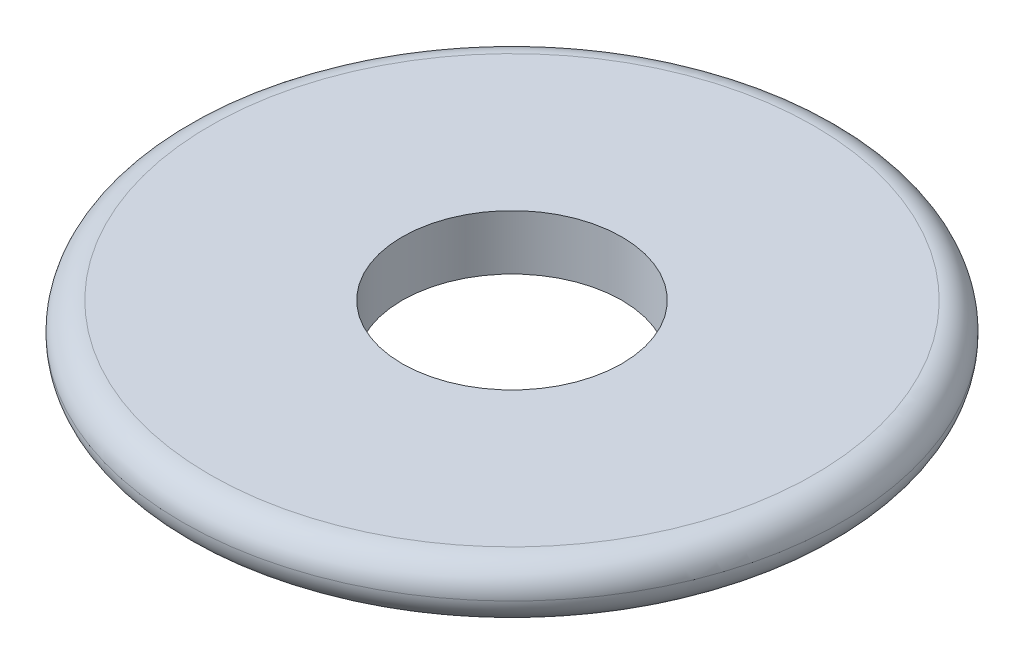
ISO-10303-21;
HEADER;
FILE_DESCRIPTION(('STEP AP214'),'2;1');
FILE_NAME('part.step','',(''),(''),'','','');
FILE_SCHEMA(('AUTOMOTIVE_DESIGN { 1 0 10303 214 1 1 1 1 }'));
ENDSEC;
DATA;
#1=APPLICATION_CONTEXT('core data for automotive mechanical design processes');
#2=APPLICATION_PROTOCOL_DEFINITION('international standard','automotive_design',2000,#1);
#3=PRODUCT_CONTEXT('',#1,'mechanical');
#4=PRODUCT('Part','Part','',(#3));
#5=PRODUCT_RELATED_PRODUCT_CATEGORY('part','',(#4));
#6=PRODUCT_DEFINITION_FORMATION('','',#4);
#7=PRODUCT_DEFINITION_CONTEXT('part definition',#1,'design');
#8=PRODUCT_DEFINITION('design','',#6,#7);
#9=PRODUCT_DEFINITION_SHAPE('','',#8);
#10=(LENGTH_UNIT() NAMED_UNIT(*) SI_UNIT(.MILLI.,.METRE.));
#11=(NAMED_UNIT(*) PLANE_ANGLE_UNIT() SI_UNIT($,.RADIAN.));
#12=(NAMED_UNIT(*) SI_UNIT($,.STERADIAN.) SOLID_ANGLE_UNIT());
#13=UNCERTAINTY_MEASURE_WITH_UNIT(LENGTH_MEASURE(1.E-05),#10,'distance_accuracy_value','');
#14=(GEOMETRIC_REPRESENTATION_CONTEXT(3) GLOBAL_UNCERTAINTY_ASSIGNED_CONTEXT((#13)) GLOBAL_UNIT_ASSIGNED_CONTEXT((#10,
#11,#12)) REPRESENTATION_CONTEXT('',''));
#15=CARTESIAN_POINT('',(0.,0.,0.));
#16=DIRECTION('',(0.,0.,1.));
#17=DIRECTION('',(1.,0.,0.));
#18=AXIS2_PLACEMENT_3D('',#15,#16,#17);
#19=CARTESIAN_POINT('',(0.,1.,0.));
#20=DIRECTION('',(0.,1.,0.));
#21=DIRECTION('',(0.,0.,1.));
#22=AXIS2_PLACEMENT_3D('',#19,#20,#21);
#23=PLANE('',#22);
#24=CARTESIAN_POINT('',(0.,1.,0.));
#25=DIRECTION('',(0.,1.,0.));
#26=DIRECTION('',(0.,0.,1.));
#27=AXIS2_PLACEMENT_3D('',#24,#25,#26);
#28=CIRCLE('',#27,11.);
#29=CARTESIAN_POINT('',(0.,1.,11.));
#30=VERTEX_POINT('',#29);
#31=EDGE_CURVE('E10',#30,#30,#28,.T.);
#32=ORIENTED_EDGE('',*,*,#31,.T.);
#33=EDGE_LOOP('',(#32));
#34=FACE_BOUND('',#33,.T.);
#35=CARTESIAN_POINT('',(0.,1.,0.));
#36=DIRECTION('',(0.,1.,0.));
#37=DIRECTION('',(0.,0.,1.));
#38=AXIS2_PLACEMENT_3D('',#35,#36,#37);
#39=CIRCLE('',#38,4.);
#40=CARTESIAN_POINT('',(0.,1.,4.));
#41=VERTEX_POINT('',#40);
#42=EDGE_CURVE('E44',#41,#41,#39,.T.);
#43=ORIENTED_EDGE('',*,*,#42,.F.);
#44=EDGE_LOOP('',(#43));
#45=FACE_BOUND('',#44,.T.);
#46=ADVANCED_FACE('F32',(#34,#45),#23,.T.);
#47=CARTESIAN_POINT('',(0.,-1.,0.));
#48=DIRECTION('',(0.,1.,0.));
#49=DIRECTION('',(0.,0.,1.));
#50=AXIS2_PLACEMENT_3D('',#47,#48,#49);
#51=PLANE('',#50);
#52=CARTESIAN_POINT('',(0.,-1.,0.));
#53=DIRECTION('',(0.,1.,0.));
#54=DIRECTION('',(0.,0.,1.));
#55=AXIS2_PLACEMENT_3D('',#52,#53,#54);
#56=CIRCLE('',#55,11.);
#57=CARTESIAN_POINT('',(0.,-1.,11.));
#58=VERTEX_POINT('',#57);
#59=EDGE_CURVE('E40',#58,#58,#56,.F.);
#60=ORIENTED_EDGE('',*,*,#59,.T.);
#61=EDGE_LOOP('',(#60));
#62=FACE_BOUND('',#61,.T.);
#63=CARTESIAN_POINT('',(0.,-1.,0.));
#64=DIRECTION('',(0.,1.,0.));
#65=DIRECTION('',(0.,0.,1.));
#66=AXIS2_PLACEMENT_3D('',#63,#64,#65);
#67=CIRCLE('',#66,4.);
#68=CARTESIAN_POINT('',(0.,-1.,4.));
#69=VERTEX_POINT('',#68);
#70=EDGE_CURVE('E47',#69,#69,#67,.T.);
#71=ORIENTED_EDGE('',*,*,#70,.T.);
#72=EDGE_LOOP('',(#71));
#73=FACE_BOUND('',#72,.T.);
#74=ADVANCED_FACE('F57',(#62,#73),#51,.F.);
#75=CARTESIAN_POINT('',(0.,1.,0.));
#76=DIRECTION('',(0.,-1.,0.));
#77=DIRECTION('',(0.,0.,-1.));
#78=AXIS2_PLACEMENT_3D('',#75,#76,#77);
#79=CYLINDRICAL_SURFACE('',#78,4.);
#80=ORIENTED_EDGE('',*,*,#42,.T.);
#81=EDGE_LOOP('',(#80));
#82=FACE_BOUND('',#81,.T.);
#83=ORIENTED_EDGE('',*,*,#70,.F.);
#84=EDGE_LOOP('',(#83));
#85=FACE_BOUND('',#84,.T.);
#86=ADVANCED_FACE('F53',(#82,#85),#79,.F.);
#87=CARTESIAN_POINT('',(0.,0.,0.));
#88=DIRECTION('',(0.,1.,0.));
#89=DIRECTION('',(0.,0.,1.));
#90=AXIS2_PLACEMENT_3D('',#87,#88,#89);
#91=TOROIDAL_SURFACE('',#90,11.,1.);
#92=ORIENTED_EDGE('',*,*,#31,.F.);
#93=EDGE_LOOP('',(#92));
#94=FACE_BOUND('',#93,.T.);
#95=CARTESIAN_POINT('',(0.,0.,0.));
#96=DIRECTION('',(0.,1.,0.));
#97=DIRECTION('',(0.,0.,1.));
#98=AXIS2_PLACEMENT_3D('',#95,#96,#97);
#99=CIRCLE('',#98,12.);
#100=CARTESIAN_POINT('',(0.,0.,12.));
#101=VERTEX_POINT('',#100);
#102=EDGE_CURVE('E36',#101,#101,#99,.F.);
#103=ORIENTED_EDGE('',*,*,#102,.F.);
#104=EDGE_LOOP('',(#103));
#105=FACE_BOUND('',#104,.T.);
#106=ADVANCED_FACE('F34',(#94,#105),#91,.T.);
#107=CARTESIAN_POINT('',(0.,0.,0.));
#108=DIRECTION('',(0.,1.,0.));
#109=DIRECTION('',(0.,0.,1.));
#110=AXIS2_PLACEMENT_3D('',#107,#108,#109);
#111=TOROIDAL_SURFACE('',#110,11.,1.);
#112=ORIENTED_EDGE('',*,*,#59,.F.);
#113=EDGE_LOOP('',(#112));
#114=FACE_BOUND('',#113,.T.);
#115=ORIENTED_EDGE('',*,*,#102,.T.);
#116=EDGE_LOOP('',(#115));
#117=FACE_BOUND('',#116,.T.);
#118=ADVANCED_FACE('F65',(#114,#117),#111,.T.);
#119=CLOSED_SHELL('',(#46,#74,#86,#106,#118));
#120=MANIFOLD_SOLID_BREP('B2',#119);
#121=ADVANCED_BREP_SHAPE_REPRESENTATION('',(#18,#120),#14);
#122=SHAPE_DEFINITION_REPRESENTATION(#9,#121);
ENDSEC;
END-ISO-10303-21;
